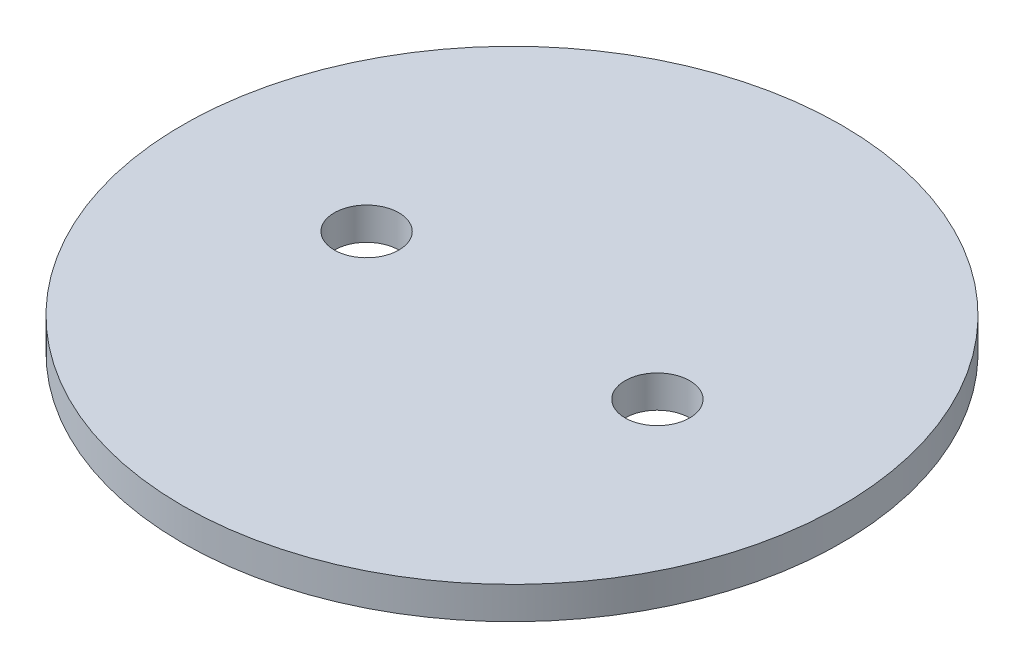
ISO-10303-21;
HEADER;
FILE_DESCRIPTION(('STEP AP214'),'2;1');
FILE_NAME('part.step','',(''),(''),'','','');
FILE_SCHEMA(('AUTOMOTIVE_DESIGN { 1 0 10303 214 1 1 1 1 }'));
ENDSEC;
DATA;
#1=APPLICATION_CONTEXT('core data for automotive mechanical design processes');
#2=APPLICATION_PROTOCOL_DEFINITION('international standard','automotive_design',2000,#1);
#3=PRODUCT_CONTEXT('',#1,'mechanical');
#4=PRODUCT('Part','Part','',(#3));
#5=PRODUCT_RELATED_PRODUCT_CATEGORY('part','',(#4));
#6=PRODUCT_DEFINITION_FORMATION('','',#4);
#7=PRODUCT_DEFINITION_CONTEXT('part definition',#1,'design');
#8=PRODUCT_DEFINITION('design','',#6,#7);
#9=PRODUCT_DEFINITION_SHAPE('','',#8);
#10=(LENGTH_UNIT() NAMED_UNIT(*) SI_UNIT(.MILLI.,.METRE.));
#11=(NAMED_UNIT(*) PLANE_ANGLE_UNIT() SI_UNIT($,.RADIAN.));
#12=(NAMED_UNIT(*) SI_UNIT($,.STERADIAN.) SOLID_ANGLE_UNIT());
#13=UNCERTAINTY_MEASURE_WITH_UNIT(LENGTH_MEASURE(1.E-05),#10,'distance_accuracy_value','');
#14=(GEOMETRIC_REPRESENTATION_CONTEXT(3) GLOBAL_UNCERTAINTY_ASSIGNED_CONTEXT((#13)) GLOBAL_UNIT_ASSIGNED_CONTEXT((#10,
#11,#12)) REPRESENTATION_CONTEXT('',''));
#15=CARTESIAN_POINT('',(0.,0.,0.));
#16=DIRECTION('',(0.,0.,1.));
#17=DIRECTION('',(1.,0.,0.));
#18=AXIS2_PLACEMENT_3D('',#15,#16,#17);
#19=CARTESIAN_POINT('',(0.,10.,0.));
#20=DIRECTION('',(0.,1.,0.));
#21=DIRECTION('',(0.,0.,1.));
#22=AXIS2_PLACEMENT_3D('',#19,#20,#21);
#23=PLANE('',#22);
#24=CARTESIAN_POINT('',(-45.,10.,0.));
#25=DIRECTION('',(0.,1.,0.));
#26=DIRECTION('',(0.,0.,1.));
#27=AXIS2_PLACEMENT_3D('',#24,#25,#26);
#28=CIRCLE('',#27,10.);
#29=CARTESIAN_POINT('',(-45.,10.,10.));
#30=VERTEX_POINT('',#29);
#31=EDGE_CURVE('E50',#30,#30,#28,.T.);
#32=ORIENTED_EDGE('',*,*,#31,.F.);
#33=EDGE_LOOP('',(#32));
#34=FACE_BOUND('',#33,.T.);
#35=CARTESIAN_POINT('',(0.,10.,0.));
#36=DIRECTION('',(0.,1.,0.));
#37=DIRECTION('',(0.,0.,1.));
#38=AXIS2_PLACEMENT_3D('',#35,#36,#37);
#39=CIRCLE('',#38,102.);
#40=CARTESIAN_POINT('',(0.,10.,102.));
#41=VERTEX_POINT('',#40);
#42=EDGE_CURVE('E10',#41,#41,#39,.T.);
#43=ORIENTED_EDGE('',*,*,#42,.T.);
#44=EDGE_LOOP('',(#43));
#45=FACE_BOUND('',#44,.T.);
#46=CARTESIAN_POINT('',(45.,10.,0.));
#47=DIRECTION('',(0.,1.,0.));
#48=DIRECTION('',(0.,0.,1.));
#49=AXIS2_PLACEMENT_3D('',#46,#47,#48);
#50=CIRCLE('',#49,10.);
#51=CARTESIAN_POINT('',(45.,10.,10.));
#52=VERTEX_POINT('',#51);
#53=EDGE_CURVE('E55',#52,#52,#50,.T.);
#54=ORIENTED_EDGE('',*,*,#53,.F.);
#55=EDGE_LOOP('',(#54));
#56=FACE_BOUND('',#55,.T.);
#57=ADVANCED_FACE('F39',(#34,#45,#56),#23,.T.);
#58=CARTESIAN_POINT('',(0.,0.,0.));
#59=DIRECTION('',(0.,1.,0.));
#60=DIRECTION('',(0.,0.,1.));
#61=AXIS2_PLACEMENT_3D('',#58,#59,#60);
#62=PLANE('',#61);
#63=CARTESIAN_POINT('',(0.,0.,0.));
#64=DIRECTION('',(0.,1.,0.));
#65=DIRECTION('',(0.,0.,1.));
#66=AXIS2_PLACEMENT_3D('',#63,#64,#65);
#67=CIRCLE('',#66,102.);
#68=CARTESIAN_POINT('',(0.,0.,102.));
#69=VERTEX_POINT('',#68);
#70=EDGE_CURVE('E43',#69,#69,#67,.T.);
#71=ORIENTED_EDGE('',*,*,#70,.F.);
#72=EDGE_LOOP('',(#71));
#73=FACE_BOUND('',#72,.T.);
#74=CARTESIAN_POINT('',(-45.,0.,0.));
#75=DIRECTION('',(0.,1.,0.));
#76=DIRECTION('',(0.,0.,1.));
#77=AXIS2_PLACEMENT_3D('',#74,#75,#76);
#78=CIRCLE('',#77,10.);
#79=CARTESIAN_POINT('',(-45.,0.,10.));
#80=VERTEX_POINT('',#79);
#81=EDGE_CURVE('E52',#80,#80,#78,.T.);
#82=ORIENTED_EDGE('',*,*,#81,.T.);
#83=EDGE_LOOP('',(#82));
#84=FACE_BOUND('',#83,.T.);
#85=CARTESIAN_POINT('',(45.,0.,0.));
#86=DIRECTION('',(0.,1.,0.));
#87=DIRECTION('',(0.,0.,1.));
#88=AXIS2_PLACEMENT_3D('',#85,#86,#87);
#89=CIRCLE('',#88,10.);
#90=CARTESIAN_POINT('',(45.,0.,10.));
#91=VERTEX_POINT('',#90);
#92=EDGE_CURVE('E58',#91,#91,#89,.T.);
#93=ORIENTED_EDGE('',*,*,#92,.T.);
#94=EDGE_LOOP('',(#93));
#95=FACE_BOUND('',#94,.T.);
#96=ADVANCED_FACE('F68',(#73,#84,#95),#62,.F.);
#97=CARTESIAN_POINT('',(0.,10.,0.));
#98=DIRECTION('',(0.,-1.,0.));
#99=DIRECTION('',(0.,0.,-1.));
#100=AXIS2_PLACEMENT_3D('',#97,#98,#99);
#101=CYLINDRICAL_SURFACE('',#100,102.);
#102=ORIENTED_EDGE('',*,*,#42,.F.);
#103=EDGE_LOOP('',(#102));
#104=FACE_BOUND('',#103,.T.);
#105=ORIENTED_EDGE('',*,*,#70,.T.);
#106=EDGE_LOOP('',(#105));
#107=FACE_BOUND('',#106,.T.);
#108=ADVANCED_FACE('F41',(#104,#107),#101,.T.);
#109=CARTESIAN_POINT('',(-45.,10.,0.));
#110=DIRECTION('',(0.,-1.,0.));
#111=DIRECTION('',(0.,0.,-1.));
#112=AXIS2_PLACEMENT_3D('',#109,#110,#111);
#113=CYLINDRICAL_SURFACE('',#112,10.);
#114=ORIENTED_EDGE('',*,*,#31,.T.);
#115=EDGE_LOOP('',(#114));
#116=FACE_BOUND('',#115,.T.);
#117=ORIENTED_EDGE('',*,*,#81,.F.);
#118=EDGE_LOOP('',(#117));
#119=FACE_BOUND('',#118,.T.);
#120=ADVANCED_FACE('F77',(#116,#119),#113,.F.);
#121=CARTESIAN_POINT('',(45.,10.,0.));
#122=DIRECTION('',(0.,-1.,0.));
#123=DIRECTION('',(0.,0.,-1.));
#124=AXIS2_PLACEMENT_3D('',#121,#122,#123);
#125=CYLINDRICAL_SURFACE('',#124,10.);
#126=ORIENTED_EDGE('',*,*,#53,.T.);
#127=EDGE_LOOP('',(#126));
#128=FACE_BOUND('',#127,.T.);
#129=ORIENTED_EDGE('',*,*,#92,.F.);
#130=EDGE_LOOP('',(#129));
#131=FACE_BOUND('',#130,.T.);
#132=ADVANCED_FACE('F64',(#128,#131),#125,.F.);
#133=CLOSED_SHELL('',(#57,#96,#108,#120,#132));
#134=MANIFOLD_SOLID_BREP('B2',#133);
#135=ADVANCED_BREP_SHAPE_REPRESENTATION('',(#18,#134),#14);
#136=SHAPE_DEFINITION_REPRESENTATION(#9,#135);
ENDSEC;
END-ISO-10303-21;
